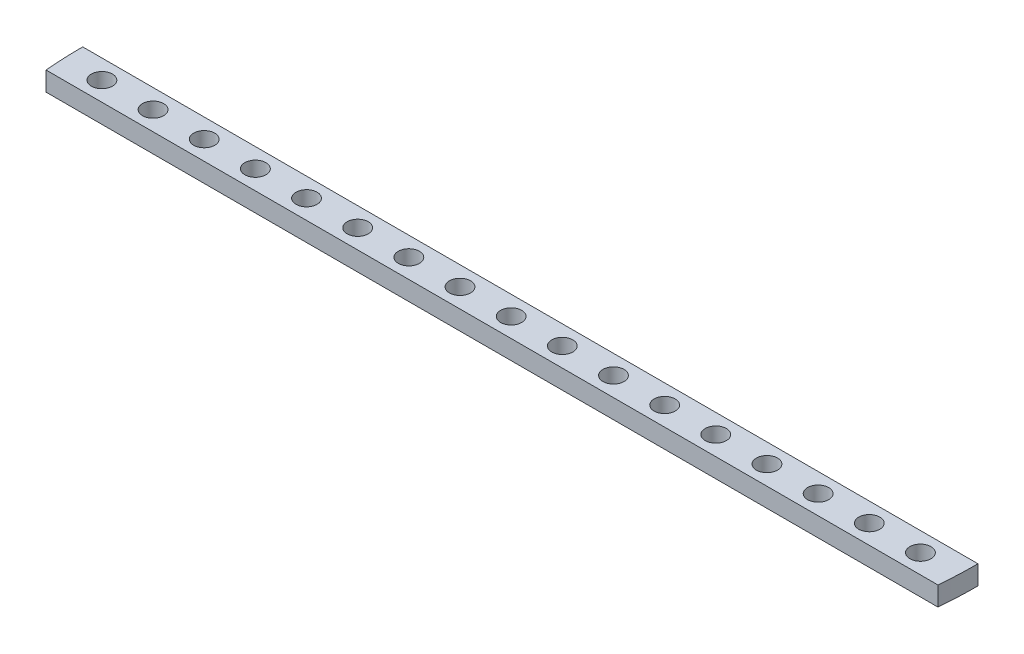
ISO-10303-21;
HEADER;
FILE_DESCRIPTION(('STEP AP214'),'2;1');
FILE_NAME('part.step','',(''),(''),'','','');
FILE_SCHEMA(('AUTOMOTIVE_DESIGN { 1 0 10303 214 1 1 1 1 }'));
ENDSEC;
DATA;
#1=APPLICATION_CONTEXT('core data for automotive mechanical design processes');
#2=APPLICATION_PROTOCOL_DEFINITION('international standard','automotive_design',2000,#1);
#3=PRODUCT_CONTEXT('',#1,'mechanical');
#4=PRODUCT('Part','Part','',(#3));
#5=PRODUCT_RELATED_PRODUCT_CATEGORY('part','',(#4));
#6=PRODUCT_DEFINITION_FORMATION('','',#4);
#7=PRODUCT_DEFINITION_CONTEXT('part definition',#1,'design');
#8=PRODUCT_DEFINITION('design','',#6,#7);
#9=PRODUCT_DEFINITION_SHAPE('','',#8);
#10=(LENGTH_UNIT() NAMED_UNIT(*) SI_UNIT(.MILLI.,.METRE.));
#11=(NAMED_UNIT(*) PLANE_ANGLE_UNIT() SI_UNIT($,.RADIAN.));
#12=(NAMED_UNIT(*) SI_UNIT($,.STERADIAN.) SOLID_ANGLE_UNIT());
#13=UNCERTAINTY_MEASURE_WITH_UNIT(LENGTH_MEASURE(1.E-05),#10,'distance_accuracy_value','');
#14=(GEOMETRIC_REPRESENTATION_CONTEXT(3) GLOBAL_UNCERTAINTY_ASSIGNED_CONTEXT((#13)) GLOBAL_UNIT_ASSIGNED_CONTEXT((#10,
#11,#12)) REPRESENTATION_CONTEXT('',''));
#15=CARTESIAN_POINT('',(0.,0.,0.));
#16=DIRECTION('',(0.,0.,1.));
#17=DIRECTION('',(1.,0.,0.));
#18=AXIS2_PLACEMENT_3D('',#15,#16,#17);
#19=CARTESIAN_POINT('',(0.,0.,0.));
#20=DIRECTION('',(0.,1.,0.));
#21=DIRECTION('',(0.,0.,1.));
#22=AXIS2_PLACEMENT_3D('',#19,#20,#21);
#23=CYLINDRICAL_SURFACE('',#22,70.);
#24=CARTESIAN_POINT('',(0.,3.,0.));
#25=DIRECTION('',(0.,-1.,0.));
#26=DIRECTION('',(0.,0.,-1.));
#27=AXIS2_PLACEMENT_3D('',#24,#25,#26);
#28=CIRCLE('',#27,70.);
#29=CARTESIAN_POINT('',(-70.,3.,0.));
#30=VERTEX_POINT('',#29);
#31=CARTESIAN_POINT('',(-69.7423830966508,3.,6.));
#32=VERTEX_POINT('',#31);
#33=EDGE_CURVE('E55',#30,#32,#28,.F.);
#34=ORIENTED_EDGE('',*,*,#33,.F.);
#35=DIRECTION('',(0.,1.,0.));
#36=VECTOR('',#35,1.);
#37=CARTESIAN_POINT('',(-70.,0.,0.));
#38=LINE('',#37,#36);
#39=CARTESIAN_POINT('',(-70.,0.,0.));
#40=VERTEX_POINT('',#39);
#41=EDGE_CURVE('E91',#40,#30,#38,.T.);
#42=ORIENTED_EDGE('',*,*,#41,.F.);
#43=CARTESIAN_POINT('',(0.,0.,0.));
#44=DIRECTION('',(0.,1.,0.));
#45=DIRECTION('',(0.,0.,1.));
#46=AXIS2_PLACEMENT_3D('',#43,#44,#45);
#47=CIRCLE('',#46,70.);
#48=CARTESIAN_POINT('',(-69.7423830966508,0.,6.));
#49=VERTEX_POINT('',#48);
#50=EDGE_CURVE('E106',#40,#49,#47,.T.);
#51=ORIENTED_EDGE('',*,*,#50,.T.);
#52=DIRECTION('',(0.,1.,0.));
#53=VECTOR('',#52,1.);
#54=CARTESIAN_POINT('',(-69.7423830966508,0.,6.));
#55=LINE('',#54,#53);
#56=EDGE_CURVE('E196',#49,#32,#55,.T.);
#57=ORIENTED_EDGE('',*,*,#56,.T.);
#58=EDGE_LOOP('',(#34,#42,#51,#57));
#59=FACE_BOUND('',#58,.T.);
#60=ADVANCED_FACE('F40',(#59),#23,.T.);
#61=CARTESIAN_POINT('',(0.,0.,0.));
#62=DIRECTION('',(0.,-1.,0.));
#63=DIRECTION('',(0.,0.,-1.));
#64=AXIS2_PLACEMENT_3D('',#61,#62,#63);
#65=PLANE('',#64);
#66=CARTESIAN_POINT('',(0.,0.,3.00000000000001));
#67=DIRECTION('',(0.,-1.,0.));
#68=DIRECTION('',(0.,0.,-1.));
#69=AXIS2_PLACEMENT_3D('',#66,#67,#68);
#70=CIRCLE('',#69,1.65);
#71=CARTESIAN_POINT('',(0.,0.,1.35000000000001));
#72=VERTEX_POINT('',#71);
#73=EDGE_CURVE('E99',#72,#72,#70,.T.);
#74=ORIENTED_EDGE('',*,*,#73,.F.);
#75=EDGE_LOOP('',(#74));
#76=FACE_BOUND('',#75,.T.);
#77=CARTESIAN_POINT('',(-8.,0.,3.00000000000001));
#78=DIRECTION('',(0.,-1.,0.));
#79=DIRECTION('',(0.,0.,-1.));
#80=AXIS2_PLACEMENT_3D('',#77,#78,#79);
#81=CIRCLE('',#80,1.65);
#82=CARTESIAN_POINT('',(-8.,0.,1.35000000000001));
#83=VERTEX_POINT('',#82);
#84=EDGE_CURVE('E104',#83,#83,#81,.T.);
#85=ORIENTED_EDGE('',*,*,#84,.F.);
#86=EDGE_LOOP('',(#85));
#87=FACE_BOUND('',#86,.T.);
#88=CARTESIAN_POINT('',(-16.,0.,3.00000000000001));
#89=DIRECTION('',(0.,-1.,0.));
#90=DIRECTION('',(0.,0.,-1.));
#91=AXIS2_PLACEMENT_3D('',#88,#89,#90);
#92=CIRCLE('',#91,1.65);
#93=CARTESIAN_POINT('',(-16.,0.,1.35000000000001));
#94=VERTEX_POINT('',#93);
#95=EDGE_CURVE('E118',#94,#94,#92,.T.);
#96=ORIENTED_EDGE('',*,*,#95,.F.);
#97=EDGE_LOOP('',(#96));
#98=FACE_BOUND('',#97,.T.);
#99=CARTESIAN_POINT('',(-40.,0.,3.00000000000002));
#100=DIRECTION('',(0.,-1.,0.));
#101=DIRECTION('',(0.,0.,-1.));
#102=AXIS2_PLACEMENT_3D('',#99,#100,#101);
#103=CIRCLE('',#102,1.65);
#104=CARTESIAN_POINT('',(-40.,0.,1.35000000000001));
#105=VERTEX_POINT('',#104);
#106=EDGE_CURVE('E122',#105,#105,#103,.T.);
#107=ORIENTED_EDGE('',*,*,#106,.F.);
#108=EDGE_LOOP('',(#107));
#109=FACE_BOUND('',#108,.T.);
#110=CARTESIAN_POINT('',(8.,0.,3.00000000000001));
#111=DIRECTION('',(0.,-1.,0.));
#112=DIRECTION('',(0.,0.,-1.));
#113=AXIS2_PLACEMENT_3D('',#110,#111,#112);
#114=CIRCLE('',#113,1.65);
#115=CARTESIAN_POINT('',(8.,0.,1.35000000000001));
#116=VERTEX_POINT('',#115);
#117=EDGE_CURVE('E126',#116,#116,#114,.T.);
#118=ORIENTED_EDGE('',*,*,#117,.F.);
#119=EDGE_LOOP('',(#118));
#120=FACE_BOUND('',#119,.T.);
#121=CARTESIAN_POINT('',(16.,0.,3.00000000000001));
#122=DIRECTION('',(0.,-1.,0.));
#123=DIRECTION('',(0.,0.,-1.));
#124=AXIS2_PLACEMENT_3D('',#121,#122,#123);
#125=CIRCLE('',#124,1.65);
#126=CARTESIAN_POINT('',(16.,0.,1.35000000000001));
#127=VERTEX_POINT('',#126);
#128=EDGE_CURVE('E130',#127,#127,#125,.T.);
#129=ORIENTED_EDGE('',*,*,#128,.F.);
#130=EDGE_LOOP('',(#129));
#131=FACE_BOUND('',#130,.T.);
#132=CARTESIAN_POINT('',(24.,0.,3.00000000000001));
#133=DIRECTION('',(0.,-1.,0.));
#134=DIRECTION('',(0.,0.,-1.));
#135=AXIS2_PLACEMENT_3D('',#132,#133,#134);
#136=CIRCLE('',#135,1.65);
#137=CARTESIAN_POINT('',(24.,0.,1.35000000000001));
#138=VERTEX_POINT('',#137);
#139=EDGE_CURVE('E134',#138,#138,#136,.T.);
#140=ORIENTED_EDGE('',*,*,#139,.F.);
#141=EDGE_LOOP('',(#140));
#142=FACE_BOUND('',#141,.T.);
#143=CARTESIAN_POINT('',(32.,0.,3.00000000000001));
#144=DIRECTION('',(0.,-1.,0.));
#145=DIRECTION('',(0.,0.,-1.));
#146=AXIS2_PLACEMENT_3D('',#143,#144,#145);
#147=CIRCLE('',#146,1.65);
#148=CARTESIAN_POINT('',(32.,0.,1.35000000000001));
#149=VERTEX_POINT('',#148);
#150=EDGE_CURVE('E138',#149,#149,#147,.T.);
#151=ORIENTED_EDGE('',*,*,#150,.F.);
#152=EDGE_LOOP('',(#151));
#153=FACE_BOUND('',#152,.T.);
#154=CARTESIAN_POINT('',(40.,0.,3.00000000000001));
#155=DIRECTION('',(0.,-1.,0.));
#156=DIRECTION('',(0.,0.,-1.));
#157=AXIS2_PLACEMENT_3D('',#154,#155,#156);
#158=CIRCLE('',#157,1.65);
#159=CARTESIAN_POINT('',(40.,0.,1.35000000000001));
#160=VERTEX_POINT('',#159);
#161=EDGE_CURVE('E142',#160,#160,#158,.T.);
#162=ORIENTED_EDGE('',*,*,#161,.F.);
#163=EDGE_LOOP('',(#162));
#164=FACE_BOUND('',#163,.T.);
#165=CARTESIAN_POINT('',(-32.,0.,3.00000000000002));
#166=DIRECTION('',(0.,-1.,0.));
#167=DIRECTION('',(0.,0.,-1.));
#168=AXIS2_PLACEMENT_3D('',#165,#166,#167);
#169=CIRCLE('',#168,1.65);
#170=CARTESIAN_POINT('',(-32.,0.,1.35000000000001));
#171=VERTEX_POINT('',#170);
#172=EDGE_CURVE('E146',#171,#171,#169,.T.);
#173=ORIENTED_EDGE('',*,*,#172,.F.);
#174=EDGE_LOOP('',(#173));
#175=FACE_BOUND('',#174,.T.);
#176=CARTESIAN_POINT('',(-24.,0.,3.00000000000001));
#177=DIRECTION('',(0.,-1.,0.));
#178=DIRECTION('',(0.,0.,-1.));
#179=AXIS2_PLACEMENT_3D('',#176,#177,#178);
#180=CIRCLE('',#179,1.65);
#181=CARTESIAN_POINT('',(-24.,0.,1.35000000000001));
#182=VERTEX_POINT('',#181);
#183=EDGE_CURVE('E113',#182,#182,#180,.T.);
#184=ORIENTED_EDGE('',*,*,#183,.F.);
#185=EDGE_LOOP('',(#184));
#186=FACE_BOUND('',#185,.T.);
#187=CARTESIAN_POINT('',(48.,0.,3.00000000000001));
#188=DIRECTION('',(0.,1.,0.));
#189=DIRECTION('',(0.,0.,1.));
#190=AXIS2_PLACEMENT_3D('',#187,#188,#189);
#191=CIRCLE('',#190,1.65);
#192=CARTESIAN_POINT('',(48.,0.,4.65000000000001));
#193=VERTEX_POINT('',#192);
#194=EDGE_CURVE('E164',#193,#193,#191,.T.);
#195=ORIENTED_EDGE('',*,*,#194,.T.);
#196=EDGE_LOOP('',(#195));
#197=FACE_BOUND('',#196,.T.);
#198=CARTESIAN_POINT('',(56.,0.,3.00000000000001));
#199=DIRECTION('',(0.,1.,0.));
#200=DIRECTION('',(0.,0.,1.));
#201=AXIS2_PLACEMENT_3D('',#198,#199,#200);
#202=CIRCLE('',#201,1.65);
#203=CARTESIAN_POINT('',(56.,0.,4.65000000000001));
#204=VERTEX_POINT('',#203);
#205=EDGE_CURVE('E168',#204,#204,#202,.T.);
#206=ORIENTED_EDGE('',*,*,#205,.T.);
#207=EDGE_LOOP('',(#206));
#208=FACE_BOUND('',#207,.T.);
#209=CARTESIAN_POINT('',(64.,0.,3.00000000000001));
#210=DIRECTION('',(0.,1.,0.));
#211=DIRECTION('',(0.,0.,1.));
#212=AXIS2_PLACEMENT_3D('',#209,#210,#211);
#213=CIRCLE('',#212,1.65);
#214=CARTESIAN_POINT('',(64.,0.,4.65000000000001));
#215=VERTEX_POINT('',#214);
#216=EDGE_CURVE('E172',#215,#215,#213,.T.);
#217=ORIENTED_EDGE('',*,*,#216,.T.);
#218=EDGE_LOOP('',(#217));
#219=FACE_BOUND('',#218,.T.);
#220=CARTESIAN_POINT('',(-48.,0.,3.00000000000029));
#221=DIRECTION('',(0.,1.,0.));
#222=DIRECTION('',(0.,0.,1.));
#223=AXIS2_PLACEMENT_3D('',#220,#221,#222);
#224=CIRCLE('',#223,1.65);
#225=CARTESIAN_POINT('',(-48.,0.,4.65000000000029));
#226=VERTEX_POINT('',#225);
#227=EDGE_CURVE('E176',#226,#226,#224,.T.);
#228=ORIENTED_EDGE('',*,*,#227,.T.);
#229=EDGE_LOOP('',(#228));
#230=FACE_BOUND('',#229,.T.);
#231=CARTESIAN_POINT('',(-56.,0.,3.00000000000034));
#232=DIRECTION('',(0.,1.,0.));
#233=DIRECTION('',(0.,0.,1.));
#234=AXIS2_PLACEMENT_3D('',#231,#232,#233);
#235=CIRCLE('',#234,1.65);
#236=CARTESIAN_POINT('',(-56.,0.,4.65000000000035));
#237=VERTEX_POINT('',#236);
#238=EDGE_CURVE('E180',#237,#237,#235,.T.);
#239=ORIENTED_EDGE('',*,*,#238,.T.);
#240=EDGE_LOOP('',(#239));
#241=FACE_BOUND('',#240,.T.);
#242=CARTESIAN_POINT('',(-64.,0.,3.0000000000004));
#243=DIRECTION('',(0.,1.,0.));
#244=DIRECTION('',(0.,0.,1.));
#245=AXIS2_PLACEMENT_3D('',#242,#243,#244);
#246=CIRCLE('',#245,1.65);
#247=CARTESIAN_POINT('',(-64.,0.,4.6500000000004));
#248=VERTEX_POINT('',#247);
#249=EDGE_CURVE('E184',#248,#248,#246,.T.);
#250=ORIENTED_EDGE('',*,*,#249,.T.);
#251=EDGE_LOOP('',(#250));
#252=FACE_BOUND('',#251,.T.);
#253=CARTESIAN_POINT('',(69.7423830966508,0.,6.));
#254=VERTEX_POINT('',#253);
#255=CARTESIAN_POINT('',(70.,0.,0.));
#256=VERTEX_POINT('',#255);
#257=EDGE_CURVE('E96',#254,#256,#47,.T.);
#258=ORIENTED_EDGE('',*,*,#257,.F.);
#259=DIRECTION('',(-1.,0.,0.));
#260=VECTOR('',#259,1.);
#261=CARTESIAN_POINT('',(0.,0.,6.));
#262=LINE('',#261,#260);
#263=EDGE_CURVE('E187',#254,#49,#262,.T.);
#264=ORIENTED_EDGE('',*,*,#263,.T.);
#265=ORIENTED_EDGE('',*,*,#50,.F.);
#266=DIRECTION('',(-1.,0.,0.));
#267=VECTOR('',#266,1.);
#268=CARTESIAN_POINT('',(-50.,0.,0.));
#269=LINE('',#268,#267);
#270=EDGE_CURVE('E111',#256,#40,#269,.T.);
#271=ORIENTED_EDGE('',*,*,#270,.F.);
#272=EDGE_LOOP('',(#258,#264,#265,#271));
#273=FACE_BOUND('',#272,.T.);
#274=ADVANCED_FACE('F157',(#76,#87,#98,#109,#120,#131,#142,#153,#164,#175,#186,#197,#208,#219,
#230,#241,#252,#273),#65,.T.);
#275=CARTESIAN_POINT('',(0.,3.,0.));
#276=DIRECTION('',(0.,-1.,0.));
#277=DIRECTION('',(0.,0.,-1.));
#278=AXIS2_PLACEMENT_3D('',#275,#276,#277);
#279=CIRCLE('',#278,70.);
#280=CARTESIAN_POINT('',(69.7423830966508,3.,6.));
#281=VERTEX_POINT('',#280);
#282=CARTESIAN_POINT('',(70.,3.,0.));
#283=VERTEX_POINT('',#282);
#284=EDGE_CURVE('E78',#281,#283,#279,.F.);
#285=ORIENTED_EDGE('',*,*,#284,.F.);
#286=DIRECTION('',(0.,1.,0.));
#287=VECTOR('',#286,1.);
#288=CARTESIAN_POINT('',(69.7423830966508,0.,6.));
#289=LINE('',#288,#287);
#290=EDGE_CURVE('E49',#281,#254,#289,.F.);
#291=ORIENTED_EDGE('',*,*,#290,.T.);
#292=ORIENTED_EDGE('',*,*,#257,.T.);
#293=DIRECTION('',(0.,1.,0.));
#294=VECTOR('',#293,1.);
#295=CARTESIAN_POINT('',(70.,0.,0.));
#296=LINE('',#295,#294);
#297=EDGE_CURVE('E89',#256,#283,#296,.T.);
#298=ORIENTED_EDGE('',*,*,#297,.T.);
#299=EDGE_LOOP('',(#285,#291,#292,#298));
#300=FACE_BOUND('',#299,.T.);
#301=ADVANCED_FACE('F94',(#300),#23,.T.);
#302=CARTESIAN_POINT('',(-50.,4.,0.));
#303=DIRECTION('',(0.,0.,1.));
#304=DIRECTION('',(1.,0.,0.));
#305=AXIS2_PLACEMENT_3D('',#302,#303,#304);
#306=PLANE('',#305);
#307=ORIENTED_EDGE('',*,*,#41,.T.);
#308=DIRECTION('',(-1.,0.,0.));
#309=VECTOR('',#308,1.);
#310=CARTESIAN_POINT('',(70.,3.,0.));
#311=LINE('',#310,#309);
#312=EDGE_CURVE('E82',#283,#30,#311,.T.);
#313=ORIENTED_EDGE('',*,*,#312,.F.);
#314=ORIENTED_EDGE('',*,*,#297,.F.);
#315=ORIENTED_EDGE('',*,*,#270,.T.);
#316=EDGE_LOOP('',(#307,#313,#314,#315));
#317=FACE_BOUND('',#316,.T.);
#318=ADVANCED_FACE('F42',(#317),#306,.F.);
#319=CARTESIAN_POINT('',(0.,-6.,3.00000000000001));
#320=DIRECTION('',(0.,1.,0.));
#321=DIRECTION('',(0.,0.,1.));
#322=AXIS2_PLACEMENT_3D('',#319,#320,#321);
#323=CYLINDRICAL_SURFACE('',#322,1.65);
#324=CARTESIAN_POINT('',(0.,3.,3.00000000000001));
#325=DIRECTION('',(0.,-1.,0.));
#326=DIRECTION('',(0.,0.,-1.));
#327=AXIS2_PLACEMENT_3D('',#324,#325,#326);
#328=CIRCLE('',#327,1.65);
#329=CARTESIAN_POINT('',(0.,3.,1.35000000000001));
#330=VERTEX_POINT('',#329);
#331=EDGE_CURVE('E209',#330,#330,#328,.F.);
#332=ORIENTED_EDGE('',*,*,#331,.T.);
#333=EDGE_LOOP('',(#332));
#334=FACE_BOUND('',#333,.T.);
#335=ORIENTED_EDGE('',*,*,#73,.T.);
#336=EDGE_LOOP('',(#335));
#337=FACE_BOUND('',#336,.T.);
#338=ADVANCED_FACE('F304',(#334,#337),#323,.F.);
#339=CARTESIAN_POINT('',(-8.,-6.,3.00000000000001));
#340=DIRECTION('',(0.,1.,0.));
#341=DIRECTION('',(0.,0.,1.));
#342=AXIS2_PLACEMENT_3D('',#339,#340,#341);
#343=CYLINDRICAL_SURFACE('',#342,1.65);
#344=CARTESIAN_POINT('',(-8.,3.,3.00000000000001));
#345=DIRECTION('',(0.,-1.,0.));
#346=DIRECTION('',(0.,0.,-1.));
#347=AXIS2_PLACEMENT_3D('',#344,#345,#346);
#348=CIRCLE('',#347,1.65);
#349=CARTESIAN_POINT('',(-8.,3.,1.35000000000001));
#350=VERTEX_POINT('',#349);
#351=EDGE_CURVE('E212',#350,#350,#348,.F.);
#352=ORIENTED_EDGE('',*,*,#351,.T.);
#353=EDGE_LOOP('',(#352));
#354=FACE_BOUND('',#353,.T.);
#355=ORIENTED_EDGE('',*,*,#84,.T.);
#356=EDGE_LOOP('',(#355));
#357=FACE_BOUND('',#356,.T.);
#358=ADVANCED_FACE('F307',(#354,#357),#343,.F.);
#359=CARTESIAN_POINT('',(-16.,-6.,3.00000000000001));
#360=DIRECTION('',(0.,1.,0.));
#361=DIRECTION('',(0.,0.,1.));
#362=AXIS2_PLACEMENT_3D('',#359,#360,#361);
#363=CYLINDRICAL_SURFACE('',#362,1.65);
#364=CARTESIAN_POINT('',(-16.,3.,3.00000000000001));
#365=DIRECTION('',(0.,-1.,0.));
#366=DIRECTION('',(0.,0.,-1.));
#367=AXIS2_PLACEMENT_3D('',#364,#365,#366);
#368=CIRCLE('',#367,1.65);
#369=CARTESIAN_POINT('',(-16.,3.,1.35000000000001));
#370=VERTEX_POINT('',#369);
#371=EDGE_CURVE('E218',#370,#370,#368,.F.);
#372=ORIENTED_EDGE('',*,*,#371,.T.);
#373=EDGE_LOOP('',(#372));
#374=FACE_BOUND('',#373,.T.);
#375=ORIENTED_EDGE('',*,*,#95,.T.);
#376=EDGE_LOOP('',(#375));
#377=FACE_BOUND('',#376,.T.);
#378=ADVANCED_FACE('F367',(#374,#377),#363,.F.);
#379=CARTESIAN_POINT('',(-40.,-6.,3.00000000000002));
#380=DIRECTION('',(0.,1.,0.));
#381=DIRECTION('',(0.,0.,1.));
#382=AXIS2_PLACEMENT_3D('',#379,#380,#381);
#383=CYLINDRICAL_SURFACE('',#382,1.65);
#384=CARTESIAN_POINT('',(-40.,3.,3.00000000000002));
#385=DIRECTION('',(0.,-1.,0.));
#386=DIRECTION('',(0.,0.,-1.));
#387=AXIS2_PLACEMENT_3D('',#384,#385,#386);
#388=CIRCLE('',#387,1.65);
#389=CARTESIAN_POINT('',(-40.,3.,1.35000000000001));
#390=VERTEX_POINT('',#389);
#391=EDGE_CURVE('E222',#390,#390,#388,.F.);
#392=ORIENTED_EDGE('',*,*,#391,.T.);
#393=EDGE_LOOP('',(#392));
#394=FACE_BOUND('',#393,.T.);
#395=ORIENTED_EDGE('',*,*,#106,.T.);
#396=EDGE_LOOP('',(#395));
#397=FACE_BOUND('',#396,.T.);
#398=ADVANCED_FACE('F375',(#394,#397),#383,.F.);
#399=CARTESIAN_POINT('',(8.,-6.,3.00000000000001));
#400=DIRECTION('',(0.,1.,0.));
#401=DIRECTION('',(0.,0.,1.));
#402=AXIS2_PLACEMENT_3D('',#399,#400,#401);
#403=CYLINDRICAL_SURFACE('',#402,1.65);
#404=CARTESIAN_POINT('',(8.,3.,3.00000000000001));
#405=DIRECTION('',(0.,-1.,0.));
#406=DIRECTION('',(0.,0.,-1.));
#407=AXIS2_PLACEMENT_3D('',#404,#405,#406);
#408=CIRCLE('',#407,1.65);
#409=CARTESIAN_POINT('',(8.,3.,1.35000000000001));
#410=VERTEX_POINT('',#409);
#411=EDGE_CURVE('E226',#410,#410,#408,.F.);
#412=ORIENTED_EDGE('',*,*,#411,.T.);
#413=EDGE_LOOP('',(#412));
#414=FACE_BOUND('',#413,.T.);
#415=ORIENTED_EDGE('',*,*,#117,.T.);
#416=EDGE_LOOP('',(#415));
#417=FACE_BOUND('',#416,.T.);
#418=ADVANCED_FACE('F382',(#414,#417),#403,.F.);
#419=CARTESIAN_POINT('',(16.,-6.,3.00000000000001));
#420=DIRECTION('',(0.,1.,0.));
#421=DIRECTION('',(0.,0.,1.));
#422=AXIS2_PLACEMENT_3D('',#419,#420,#421);
#423=CYLINDRICAL_SURFACE('',#422,1.65);
#424=CARTESIAN_POINT('',(16.,3.,3.00000000000001));
#425=DIRECTION('',(0.,-1.,0.));
#426=DIRECTION('',(0.,0.,-1.));
#427=AXIS2_PLACEMENT_3D('',#424,#425,#426);
#428=CIRCLE('',#427,1.65);
#429=CARTESIAN_POINT('',(16.,3.,1.35000000000001));
#430=VERTEX_POINT('',#429);
#431=EDGE_CURVE('E230',#430,#430,#428,.F.);
#432=ORIENTED_EDGE('',*,*,#431,.T.);
#433=EDGE_LOOP('',(#432));
#434=FACE_BOUND('',#433,.T.);
#435=ORIENTED_EDGE('',*,*,#128,.T.);
#436=EDGE_LOOP('',(#435));
#437=FACE_BOUND('',#436,.T.);
#438=ADVANCED_FACE('F390',(#434,#437),#423,.F.);
#439=CARTESIAN_POINT('',(24.,-6.,3.00000000000001));
#440=DIRECTION('',(0.,1.,0.));
#441=DIRECTION('',(0.,0.,1.));
#442=AXIS2_PLACEMENT_3D('',#439,#440,#441);
#443=CYLINDRICAL_SURFACE('',#442,1.65);
#444=CARTESIAN_POINT('',(24.,3.,3.00000000000001));
#445=DIRECTION('',(0.,-1.,0.));
#446=DIRECTION('',(0.,0.,-1.));
#447=AXIS2_PLACEMENT_3D('',#444,#445,#446);
#448=CIRCLE('',#447,1.65);
#449=CARTESIAN_POINT('',(24.,3.,1.35000000000001));
#450=VERTEX_POINT('',#449);
#451=EDGE_CURVE('E234',#450,#450,#448,.F.);
#452=ORIENTED_EDGE('',*,*,#451,.T.);
#453=EDGE_LOOP('',(#452));
#454=FACE_BOUND('',#453,.T.);
#455=ORIENTED_EDGE('',*,*,#139,.T.);
#456=EDGE_LOOP('',(#455));
#457=FACE_BOUND('',#456,.T.);
#458=ADVANCED_FACE('F398',(#454,#457),#443,.F.);
#459=CARTESIAN_POINT('',(32.,-6.,3.00000000000001));
#460=DIRECTION('',(0.,1.,0.));
#461=DIRECTION('',(0.,0.,1.));
#462=AXIS2_PLACEMENT_3D('',#459,#460,#461);
#463=CYLINDRICAL_SURFACE('',#462,1.65);
#464=CARTESIAN_POINT('',(32.,3.,3.00000000000001));
#465=DIRECTION('',(0.,-1.,0.));
#466=DIRECTION('',(0.,0.,-1.));
#467=AXIS2_PLACEMENT_3D('',#464,#465,#466);
#468=CIRCLE('',#467,1.65);
#469=CARTESIAN_POINT('',(32.,3.,1.35000000000001));
#470=VERTEX_POINT('',#469);
#471=EDGE_CURVE('E238',#470,#470,#468,.F.);
#472=ORIENTED_EDGE('',*,*,#471,.T.);
#473=EDGE_LOOP('',(#472));
#474=FACE_BOUND('',#473,.T.);
#475=ORIENTED_EDGE('',*,*,#150,.T.);
#476=EDGE_LOOP('',(#475));
#477=FACE_BOUND('',#476,.T.);
#478=ADVANCED_FACE('F341',(#474,#477),#463,.F.);
#479=CARTESIAN_POINT('',(40.,-6.,3.00000000000001));
#480=DIRECTION('',(0.,1.,0.));
#481=DIRECTION('',(0.,0.,1.));
#482=AXIS2_PLACEMENT_3D('',#479,#480,#481);
#483=CYLINDRICAL_SURFACE('',#482,1.65);
#484=CARTESIAN_POINT('',(40.,3.,3.00000000000001));
#485=DIRECTION('',(0.,-1.,0.));
#486=DIRECTION('',(0.,0.,-1.));
#487=AXIS2_PLACEMENT_3D('',#484,#485,#486);
#488=CIRCLE('',#487,1.65);
#489=CARTESIAN_POINT('',(40.,3.,1.35000000000001));
#490=VERTEX_POINT('',#489);
#491=EDGE_CURVE('E242',#490,#490,#488,.F.);
#492=ORIENTED_EDGE('',*,*,#491,.T.);
#493=EDGE_LOOP('',(#492));
#494=FACE_BOUND('',#493,.T.);
#495=ORIENTED_EDGE('',*,*,#161,.T.);
#496=EDGE_LOOP('',(#495));
#497=FACE_BOUND('',#496,.T.);
#498=ADVANCED_FACE('F331',(#494,#497),#483,.F.);
#499=CARTESIAN_POINT('',(-32.,-6.,3.00000000000002));
#500=DIRECTION('',(0.,1.,0.));
#501=DIRECTION('',(0.,0.,1.));
#502=AXIS2_PLACEMENT_3D('',#499,#500,#501);
#503=CYLINDRICAL_SURFACE('',#502,1.65);
#504=CARTESIAN_POINT('',(-32.,3.,3.00000000000002));
#505=DIRECTION('',(0.,-1.,0.));
#506=DIRECTION('',(0.,0.,-1.));
#507=AXIS2_PLACEMENT_3D('',#504,#505,#506);
#508=CIRCLE('',#507,1.65);
#509=CARTESIAN_POINT('',(-32.,3.,1.35000000000001));
#510=VERTEX_POINT('',#509);
#511=EDGE_CURVE('E246',#510,#510,#508,.F.);
#512=ORIENTED_EDGE('',*,*,#511,.T.);
#513=EDGE_LOOP('',(#512));
#514=FACE_BOUND('',#513,.T.);
#515=ORIENTED_EDGE('',*,*,#172,.T.);
#516=EDGE_LOOP('',(#515));
#517=FACE_BOUND('',#516,.T.);
#518=ADVANCED_FACE('F329',(#514,#517),#503,.F.);
#519=CARTESIAN_POINT('',(-24.,-6.,3.00000000000001));
#520=DIRECTION('',(0.,1.,0.));
#521=DIRECTION('',(0.,0.,1.));
#522=AXIS2_PLACEMENT_3D('',#519,#520,#521);
#523=CYLINDRICAL_SURFACE('',#522,1.65);
#524=CARTESIAN_POINT('',(-24.,3.,3.00000000000001));
#525=DIRECTION('',(0.,-1.,0.));
#526=DIRECTION('',(0.,0.,-1.));
#527=AXIS2_PLACEMENT_3D('',#524,#525,#526);
#528=CIRCLE('',#527,1.65);
#529=CARTESIAN_POINT('',(-24.,3.,1.35000000000001));
#530=VERTEX_POINT('',#529);
#531=EDGE_CURVE('E250',#530,#530,#528,.F.);
#532=ORIENTED_EDGE('',*,*,#531,.T.);
#533=EDGE_LOOP('',(#532));
#534=FACE_BOUND('',#533,.T.);
#535=ORIENTED_EDGE('',*,*,#183,.T.);
#536=EDGE_LOOP('',(#535));
#537=FACE_BOUND('',#536,.T.);
#538=ADVANCED_FACE('F155',(#534,#537),#523,.F.);
#539=CARTESIAN_POINT('',(48.,0.,3.00000000000001));
#540=DIRECTION('',(0.,1.,0.));
#541=DIRECTION('',(0.,0.,1.));
#542=AXIS2_PLACEMENT_3D('',#539,#540,#541);
#543=CYLINDRICAL_SURFACE('',#542,1.65);
#544=CARTESIAN_POINT('',(48.,3.,3.00000000000001));
#545=DIRECTION('',(0.,-1.,0.));
#546=DIRECTION('',(0.,0.,-1.));
#547=AXIS2_PLACEMENT_3D('',#544,#545,#546);
#548=CIRCLE('',#547,1.65);
#549=CARTESIAN_POINT('',(48.,3.,1.35000000000001));
#550=VERTEX_POINT('',#549);
#551=EDGE_CURVE('E254',#550,#550,#548,.F.);
#552=ORIENTED_EDGE('',*,*,#551,.T.);
#553=EDGE_LOOP('',(#552));
#554=FACE_BOUND('',#553,.T.);
#555=ORIENTED_EDGE('',*,*,#194,.F.);
#556=EDGE_LOOP('',(#555));
#557=FACE_BOUND('',#556,.T.);
#558=ADVANCED_FACE('F338',(#554,#557),#543,.F.);
#559=CARTESIAN_POINT('',(56.,0.,3.00000000000001));
#560=DIRECTION('',(0.,1.,0.));
#561=DIRECTION('',(0.,0.,1.));
#562=AXIS2_PLACEMENT_3D('',#559,#560,#561);
#563=CYLINDRICAL_SURFACE('',#562,1.65);
#564=CARTESIAN_POINT('',(56.,3.,3.00000000000001));
#565=DIRECTION('',(0.,-1.,0.));
#566=DIRECTION('',(0.,0.,-1.));
#567=AXIS2_PLACEMENT_3D('',#564,#565,#566);
#568=CIRCLE('',#567,1.65);
#569=CARTESIAN_POINT('',(56.,3.,1.35000000000001));
#570=VERTEX_POINT('',#569);
#571=EDGE_CURVE('E258',#570,#570,#568,.F.);
#572=ORIENTED_EDGE('',*,*,#571,.T.);
#573=EDGE_LOOP('',(#572));
#574=FACE_BOUND('',#573,.T.);
#575=ORIENTED_EDGE('',*,*,#205,.F.);
#576=EDGE_LOOP('',(#575));
#577=FACE_BOUND('',#576,.T.);
#578=ADVANCED_FACE('F438',(#574,#577),#563,.F.);
#579=CARTESIAN_POINT('',(64.,0.,3.00000000000001));
#580=DIRECTION('',(0.,1.,0.));
#581=DIRECTION('',(0.,0.,1.));
#582=AXIS2_PLACEMENT_3D('',#579,#580,#581);
#583=CYLINDRICAL_SURFACE('',#582,1.65);
#584=CARTESIAN_POINT('',(64.,3.,3.00000000000001));
#585=DIRECTION('',(0.,-1.,0.));
#586=DIRECTION('',(0.,0.,-1.));
#587=AXIS2_PLACEMENT_3D('',#584,#585,#586);
#588=CIRCLE('',#587,1.65);
#589=CARTESIAN_POINT('',(64.,3.,1.35000000000001));
#590=VERTEX_POINT('',#589);
#591=EDGE_CURVE('E262',#590,#590,#588,.F.);
#592=ORIENTED_EDGE('',*,*,#591,.T.);
#593=EDGE_LOOP('',(#592));
#594=FACE_BOUND('',#593,.T.);
#595=ORIENTED_EDGE('',*,*,#216,.F.);
#596=EDGE_LOOP('',(#595));
#597=FACE_BOUND('',#596,.T.);
#598=ADVANCED_FACE('F448',(#594,#597),#583,.F.);
#599=CARTESIAN_POINT('',(-48.,0.,3.00000000000029));
#600=DIRECTION('',(0.,1.,0.));
#601=DIRECTION('',(0.,0.,1.));
#602=AXIS2_PLACEMENT_3D('',#599,#600,#601);
#603=CYLINDRICAL_SURFACE('',#602,1.65);
#604=CARTESIAN_POINT('',(-48.,3.,3.00000000000029));
#605=DIRECTION('',(0.,-1.,0.));
#606=DIRECTION('',(0.,0.,-1.));
#607=AXIS2_PLACEMENT_3D('',#604,#605,#606);
#608=CIRCLE('',#607,1.65);
#609=CARTESIAN_POINT('',(-48.,3.,1.35000000000029));
#610=VERTEX_POINT('',#609);
#611=EDGE_CURVE('E266',#610,#610,#608,.F.);
#612=ORIENTED_EDGE('',*,*,#611,.T.);
#613=EDGE_LOOP('',(#612));
#614=FACE_BOUND('',#613,.T.);
#615=ORIENTED_EDGE('',*,*,#227,.F.);
#616=EDGE_LOOP('',(#615));
#617=FACE_BOUND('',#616,.T.);
#618=ADVANCED_FACE('F458',(#614,#617),#603,.F.);
#619=CARTESIAN_POINT('',(-56.,0.,3.00000000000034));
#620=DIRECTION('',(0.,1.,0.));
#621=DIRECTION('',(0.,0.,1.));
#622=AXIS2_PLACEMENT_3D('',#619,#620,#621);
#623=CYLINDRICAL_SURFACE('',#622,1.65);
#624=CARTESIAN_POINT('',(-56.,3.,3.00000000000034));
#625=DIRECTION('',(0.,-1.,0.));
#626=DIRECTION('',(0.,0.,-1.));
#627=AXIS2_PLACEMENT_3D('',#624,#625,#626);
#628=CIRCLE('',#627,1.65);
#629=CARTESIAN_POINT('',(-56.,3.,1.35000000000034));
#630=VERTEX_POINT('',#629);
#631=EDGE_CURVE('E270',#630,#630,#628,.F.);
#632=ORIENTED_EDGE('',*,*,#631,.T.);
#633=EDGE_LOOP('',(#632));
#634=FACE_BOUND('',#633,.T.);
#635=ORIENTED_EDGE('',*,*,#238,.F.);
#636=EDGE_LOOP('',(#635));
#637=FACE_BOUND('',#636,.T.);
#638=ADVANCED_FACE('F468',(#634,#637),#623,.F.);
#639=CARTESIAN_POINT('',(-64.,0.,3.0000000000004));
#640=DIRECTION('',(0.,1.,0.));
#641=DIRECTION('',(0.,0.,1.));
#642=AXIS2_PLACEMENT_3D('',#639,#640,#641);
#643=CYLINDRICAL_SURFACE('',#642,1.65);
#644=CARTESIAN_POINT('',(-64.,3.,3.0000000000004));
#645=DIRECTION('',(0.,-1.,0.));
#646=DIRECTION('',(0.,0.,-1.));
#647=AXIS2_PLACEMENT_3D('',#644,#645,#646);
#648=CIRCLE('',#647,1.65);
#649=CARTESIAN_POINT('',(-64.,3.,1.3500000000004));
#650=VERTEX_POINT('',#649);
#651=EDGE_CURVE('E274',#650,#650,#648,.F.);
#652=ORIENTED_EDGE('',*,*,#651,.T.);
#653=EDGE_LOOP('',(#652));
#654=FACE_BOUND('',#653,.T.);
#655=ORIENTED_EDGE('',*,*,#249,.F.);
#656=EDGE_LOOP('',(#655));
#657=FACE_BOUND('',#656,.T.);
#658=ADVANCED_FACE('F281',(#654,#657),#643,.F.);
#659=CARTESIAN_POINT('',(0.,4.,6.));
#660=DIRECTION('',(0.,0.,1.));
#661=DIRECTION('',(1.,0.,0.));
#662=AXIS2_PLACEMENT_3D('',#659,#660,#661);
#663=PLANE('',#662);
#664=DIRECTION('',(1.,0.,0.));
#665=VECTOR('',#664,1.);
#666=CARTESIAN_POINT('',(0.,3.,6.));
#667=LINE('',#666,#665);
#668=EDGE_CURVE('E11',#32,#281,#667,.T.);
#669=ORIENTED_EDGE('',*,*,#668,.F.);
#670=ORIENTED_EDGE('',*,*,#56,.F.);
#671=ORIENTED_EDGE('',*,*,#263,.F.);
#672=ORIENTED_EDGE('',*,*,#290,.F.);
#673=EDGE_LOOP('',(#669,#670,#671,#672));
#674=FACE_BOUND('',#673,.T.);
#675=ADVANCED_FACE('F285',(#674),#663,.T.);
#676=CARTESIAN_POINT('',(70.,3.,10.));
#677=DIRECTION('',(0.,-1.,0.));
#678=DIRECTION('',(0.,0.,-1.));
#679=AXIS2_PLACEMENT_3D('',#676,#677,#678);
#680=PLANE('',#679);
#681=ORIENTED_EDGE('',*,*,#351,.F.);
#682=EDGE_LOOP('',(#681));
#683=FACE_BOUND('',#682,.T.);
#684=ORIENTED_EDGE('',*,*,#391,.F.);
#685=EDGE_LOOP('',(#684));
#686=FACE_BOUND('',#685,.T.);
#687=ORIENTED_EDGE('',*,*,#431,.F.);
#688=EDGE_LOOP('',(#687));
#689=FACE_BOUND('',#688,.T.);
#690=ORIENTED_EDGE('',*,*,#471,.F.);
#691=EDGE_LOOP('',(#690));
#692=FACE_BOUND('',#691,.T.);
#693=ORIENTED_EDGE('',*,*,#511,.F.);
#694=EDGE_LOOP('',(#693));
#695=FACE_BOUND('',#694,.T.);
#696=ORIENTED_EDGE('',*,*,#551,.F.);
#697=EDGE_LOOP('',(#696));
#698=FACE_BOUND('',#697,.T.);
#699=ORIENTED_EDGE('',*,*,#591,.F.);
#700=EDGE_LOOP('',(#699));
#701=FACE_BOUND('',#700,.T.);
#702=ORIENTED_EDGE('',*,*,#631,.F.);
#703=EDGE_LOOP('',(#702));
#704=FACE_BOUND('',#703,.T.);
#705=ORIENTED_EDGE('',*,*,#33,.T.);
#706=ORIENTED_EDGE('',*,*,#668,.T.);
#707=ORIENTED_EDGE('',*,*,#284,.T.);
#708=ORIENTED_EDGE('',*,*,#312,.T.);
#709=EDGE_LOOP('',(#705,#706,#707,#708));
#710=FACE_BOUND('',#709,.T.);
#711=ORIENTED_EDGE('',*,*,#651,.F.);
#712=EDGE_LOOP('',(#711));
#713=FACE_BOUND('',#712,.T.);
#714=ORIENTED_EDGE('',*,*,#611,.F.);
#715=EDGE_LOOP('',(#714));
#716=FACE_BOUND('',#715,.T.);
#717=ORIENTED_EDGE('',*,*,#571,.F.);
#718=EDGE_LOOP('',(#717));
#719=FACE_BOUND('',#718,.T.);
#720=ORIENTED_EDGE('',*,*,#531,.F.);
#721=EDGE_LOOP('',(#720));
#722=FACE_BOUND('',#721,.T.);
#723=ORIENTED_EDGE('',*,*,#491,.F.);
#724=EDGE_LOOP('',(#723));
#725=FACE_BOUND('',#724,.T.);
#726=ORIENTED_EDGE('',*,*,#451,.F.);
#727=EDGE_LOOP('',(#726));
#728=FACE_BOUND('',#727,.T.);
#729=ORIENTED_EDGE('',*,*,#411,.F.);
#730=EDGE_LOOP('',(#729));
#731=FACE_BOUND('',#730,.T.);
#732=ORIENTED_EDGE('',*,*,#371,.F.);
#733=EDGE_LOOP('',(#732));
#734=FACE_BOUND('',#733,.T.);
#735=ORIENTED_EDGE('',*,*,#331,.F.);
#736=EDGE_LOOP('',(#735));
#737=FACE_BOUND('',#736,.T.);
#738=ADVANCED_FACE('F80',(#683,#686,#689,#692,#695,#698,#701,#704,#710,#713,#716,#719,#722,#725,
#728,#731,#734,#737),#680,.F.);
#739=CLOSED_SHELL('',(#60,#274,#301,#318,#338,#358,#378,#398,#418,#438,#458,#478,#498,#518,#538,
#558,#578,#598,#618,#638,#658,#675,#738));
#740=MANIFOLD_SOLID_BREP('B2',#739);
#741=ADVANCED_BREP_SHAPE_REPRESENTATION('',(#18,#740),#14);
#742=SHAPE_DEFINITION_REPRESENTATION(#9,#741);
ENDSEC;
END-ISO-10303-21;
